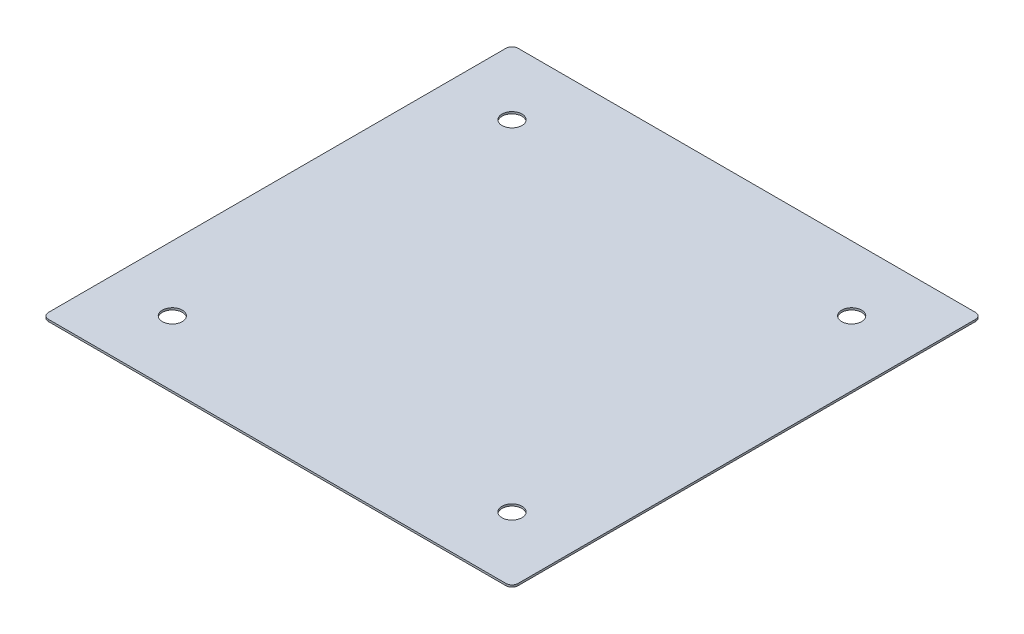
ISO-10303-21;
HEADER;
FILE_DESCRIPTION(('STEP AP214'),'2;1');
FILE_NAME('part.step','',(''),(''),'','','');
FILE_SCHEMA(('AUTOMOTIVE_DESIGN { 1 0 10303 214 1 1 1 1 }'));
ENDSEC;
DATA;
#1=APPLICATION_CONTEXT('core data for automotive mechanical design processes');
#2=APPLICATION_PROTOCOL_DEFINITION('international standard','automotive_design',2000,#1);
#3=PRODUCT_CONTEXT('',#1,'mechanical');
#4=PRODUCT('Part','Part','',(#3));
#5=PRODUCT_RELATED_PRODUCT_CATEGORY('part','',(#4));
#6=PRODUCT_DEFINITION_FORMATION('','',#4);
#7=PRODUCT_DEFINITION_CONTEXT('part definition',#1,'design');
#8=PRODUCT_DEFINITION('design','',#6,#7);
#9=PRODUCT_DEFINITION_SHAPE('','',#8);
#10=(LENGTH_UNIT() NAMED_UNIT(*) SI_UNIT(.MILLI.,.METRE.));
#11=(NAMED_UNIT(*) PLANE_ANGLE_UNIT() SI_UNIT($,.RADIAN.));
#12=(NAMED_UNIT(*) SI_UNIT($,.STERADIAN.) SOLID_ANGLE_UNIT());
#13=UNCERTAINTY_MEASURE_WITH_UNIT(LENGTH_MEASURE(1.E-05),#10,'distance_accuracy_value','');
#14=(GEOMETRIC_REPRESENTATION_CONTEXT(3) GLOBAL_UNCERTAINTY_ASSIGNED_CONTEXT((#13)) GLOBAL_UNIT_ASSIGNED_CONTEXT((#10,
#11,#12)) REPRESENTATION_CONTEXT('',''));
#15=CARTESIAN_POINT('',(0.,0.,0.));
#16=DIRECTION('',(0.,0.,1.));
#17=DIRECTION('',(1.,0.,0.));
#18=AXIS2_PLACEMENT_3D('',#15,#16,#17);
#19=CARTESIAN_POINT('',(114.5,1.,114.5));
#20=DIRECTION('',(0.,-1.,0.));
#21=DIRECTION('',(0.,0.,-1.));
#22=AXIS2_PLACEMENT_3D('',#19,#20,#21);
#23=CYLINDRICAL_SURFACE('',#22,3.);
#24=CARTESIAN_POINT('',(114.5,0.,114.5));
#25=DIRECTION('',(0.,1.,0.));
#26=DIRECTION('',(0.,0.,-1.));
#27=AXIS2_PLACEMENT_3D('',#24,#25,#26);
#28=CIRCLE('',#27,3.);
#29=CARTESIAN_POINT('',(114.5,0.,117.5));
#30=VERTEX_POINT('',#29);
#31=CARTESIAN_POINT('',(117.5,0.,114.5));
#32=VERTEX_POINT('',#31);
#33=EDGE_CURVE('E114',#30,#32,#28,.T.);
#34=ORIENTED_EDGE('',*,*,#33,.T.);
#35=DIRECTION('',(0.,-1.,0.));
#36=VECTOR('',#35,1.);
#37=CARTESIAN_POINT('',(117.5,1.,114.5));
#38=LINE('',#37,#36);
#39=CARTESIAN_POINT('',(117.5,1.,114.5));
#40=VERTEX_POINT('',#39);
#41=EDGE_CURVE('E11',#40,#32,#38,.T.);
#42=ORIENTED_EDGE('',*,*,#41,.F.);
#43=CARTESIAN_POINT('',(114.5,1.,114.5));
#44=DIRECTION('',(0.,1.,0.));
#45=DIRECTION('',(0.,0.,-1.));
#46=AXIS2_PLACEMENT_3D('',#43,#44,#45);
#47=CIRCLE('',#46,3.);
#48=CARTESIAN_POINT('',(114.5,1.,117.5));
#49=VERTEX_POINT('',#48);
#50=EDGE_CURVE('E128',#49,#40,#47,.T.);
#51=ORIENTED_EDGE('',*,*,#50,.F.);
#52=DIRECTION('',(0.,-1.,0.));
#53=VECTOR('',#52,1.);
#54=CARTESIAN_POINT('',(114.5,1.,117.5));
#55=LINE('',#54,#53);
#56=EDGE_CURVE('E108',#49,#30,#55,.T.);
#57=ORIENTED_EDGE('',*,*,#56,.T.);
#58=EDGE_LOOP('',(#34,#42,#51,#57));
#59=FACE_BOUND('',#58,.T.);
#60=ADVANCED_FACE('F17',(#59),#23,.T.);
#61=CARTESIAN_POINT('',(117.5,1.,-114.5));
#62=DIRECTION('',(-1.,0.,0.));
#63=DIRECTION('',(0.,0.,1.));
#64=AXIS2_PLACEMENT_3D('',#61,#62,#63);
#65=PLANE('',#64);
#66=DIRECTION('',(0.,0.,-1.));
#67=VECTOR('',#66,1.);
#68=CARTESIAN_POINT('',(117.5,0.,-114.5));
#69=LINE('',#68,#67);
#70=CARTESIAN_POINT('',(117.5,0.,-114.5));
#71=VERTEX_POINT('',#70);
#72=EDGE_CURVE('E116',#32,#71,#69,.T.);
#73=ORIENTED_EDGE('',*,*,#72,.T.);
#74=DIRECTION('',(0.,-1.,0.));
#75=VECTOR('',#74,1.);
#76=CARTESIAN_POINT('',(117.5,1.,-114.5));
#77=LINE('',#76,#75);
#78=CARTESIAN_POINT('',(117.5,1.,-114.5));
#79=VERTEX_POINT('',#78);
#80=EDGE_CURVE('E25',#79,#71,#77,.T.);
#81=ORIENTED_EDGE('',*,*,#80,.F.);
#82=DIRECTION('',(0.,0.,-1.));
#83=VECTOR('',#82,1.);
#84=CARTESIAN_POINT('',(117.5,1.,-114.5));
#85=LINE('',#84,#83);
#86=EDGE_CURVE('E76',#40,#79,#85,.T.);
#87=ORIENTED_EDGE('',*,*,#86,.F.);
#88=ORIENTED_EDGE('',*,*,#41,.T.);
#89=EDGE_LOOP('',(#73,#81,#87,#88));
#90=FACE_BOUND('',#89,.T.);
#91=ADVANCED_FACE('F217',(#90),#65,.F.);
#92=CARTESIAN_POINT('',(114.5,1.,-114.5));
#93=DIRECTION('',(0.,-1.,0.));
#94=DIRECTION('',(0.,0.,-1.));
#95=AXIS2_PLACEMENT_3D('',#92,#93,#94);
#96=CYLINDRICAL_SURFACE('',#95,3.);
#97=CARTESIAN_POINT('',(114.5,0.,-114.5));
#98=DIRECTION('',(0.,1.,0.));
#99=DIRECTION('',(0.,0.,1.));
#100=AXIS2_PLACEMENT_3D('',#97,#98,#99);
#101=CIRCLE('',#100,3.);
#102=CARTESIAN_POINT('',(114.5,0.,-117.5));
#103=VERTEX_POINT('',#102);
#104=EDGE_CURVE('E118',#71,#103,#101,.T.);
#105=ORIENTED_EDGE('',*,*,#104,.T.);
#106=DIRECTION('',(0.,-1.,0.));
#107=VECTOR('',#106,1.);
#108=CARTESIAN_POINT('',(114.5,1.,-117.5));
#109=LINE('',#108,#107);
#110=CARTESIAN_POINT('',(114.5,1.,-117.5));
#111=VERTEX_POINT('',#110);
#112=EDGE_CURVE('E134',#111,#103,#109,.T.);
#113=ORIENTED_EDGE('',*,*,#112,.F.);
#114=CARTESIAN_POINT('',(114.5,1.,-114.5));
#115=DIRECTION('',(0.,1.,0.));
#116=DIRECTION('',(0.,0.,1.));
#117=AXIS2_PLACEMENT_3D('',#114,#115,#116);
#118=CIRCLE('',#117,3.);
#119=EDGE_CURVE('E141',#79,#111,#118,.T.);
#120=ORIENTED_EDGE('',*,*,#119,.F.);
#121=ORIENTED_EDGE('',*,*,#80,.T.);
#122=EDGE_LOOP('',(#105,#113,#120,#121));
#123=FACE_BOUND('',#122,.T.);
#124=ADVANCED_FACE('F143',(#123),#96,.T.);
#125=CARTESIAN_POINT('',(-114.5,1.,-117.5));
#126=DIRECTION('',(0.,0.,1.));
#127=DIRECTION('',(1.,0.,0.));
#128=AXIS2_PLACEMENT_3D('',#125,#126,#127);
#129=PLANE('',#128);
#130=DIRECTION('',(-1.,0.,0.));
#131=VECTOR('',#130,1.);
#132=CARTESIAN_POINT('',(-114.5,0.,-117.5));
#133=LINE('',#132,#131);
#134=CARTESIAN_POINT('',(-114.5,0.,-117.5));
#135=VERTEX_POINT('',#134);
#136=EDGE_CURVE('E122',#103,#135,#133,.T.);
#137=ORIENTED_EDGE('',*,*,#136,.T.);
#138=DIRECTION('',(0.,-1.,0.));
#139=VECTOR('',#138,1.);
#140=CARTESIAN_POINT('',(-114.5,1.,-117.5));
#141=LINE('',#140,#139);
#142=CARTESIAN_POINT('',(-114.5,1.,-117.5));
#143=VERTEX_POINT('',#142);
#144=EDGE_CURVE('E135',#143,#135,#141,.T.);
#145=ORIENTED_EDGE('',*,*,#144,.F.);
#146=DIRECTION('',(-1.,0.,0.));
#147=VECTOR('',#146,1.);
#148=CARTESIAN_POINT('',(-114.5,1.,-117.5));
#149=LINE('',#148,#147);
#150=EDGE_CURVE('E154',#111,#143,#149,.T.);
#151=ORIENTED_EDGE('',*,*,#150,.F.);
#152=ORIENTED_EDGE('',*,*,#112,.T.);
#153=EDGE_LOOP('',(#137,#145,#151,#152));
#154=FACE_BOUND('',#153,.T.);
#155=ADVANCED_FACE('F151',(#154),#129,.F.);
#156=CARTESIAN_POINT('',(-114.5,1.,-114.5));
#157=DIRECTION('',(0.,-1.,0.));
#158=DIRECTION('',(0.,0.,-1.));
#159=AXIS2_PLACEMENT_3D('',#156,#157,#158);
#160=CYLINDRICAL_SURFACE('',#159,3.);
#161=CARTESIAN_POINT('',(-114.5,0.,-114.5));
#162=DIRECTION('',(0.,1.,0.));
#163=DIRECTION('',(0.,0.,1.));
#164=AXIS2_PLACEMENT_3D('',#161,#162,#163);
#165=CIRCLE('',#164,3.);
#166=CARTESIAN_POINT('',(-117.5,0.,-114.5));
#167=VERTEX_POINT('',#166);
#168=EDGE_CURVE('E124',#135,#167,#165,.T.);
#169=ORIENTED_EDGE('',*,*,#168,.T.);
#170=DIRECTION('',(0.,-1.,0.));
#171=VECTOR('',#170,1.);
#172=CARTESIAN_POINT('',(-117.5,1.,-114.5));
#173=LINE('',#172,#171);
#174=CARTESIAN_POINT('',(-117.5,1.,-114.5));
#175=VERTEX_POINT('',#174);
#176=EDGE_CURVE('E102',#175,#167,#173,.T.);
#177=ORIENTED_EDGE('',*,*,#176,.F.);
#178=CARTESIAN_POINT('',(-114.5,1.,-114.5));
#179=DIRECTION('',(0.,1.,0.));
#180=DIRECTION('',(0.,0.,1.));
#181=AXIS2_PLACEMENT_3D('',#178,#179,#180);
#182=CIRCLE('',#181,3.);
#183=EDGE_CURVE('E92',#143,#175,#182,.T.);
#184=ORIENTED_EDGE('',*,*,#183,.F.);
#185=ORIENTED_EDGE('',*,*,#144,.T.);
#186=EDGE_LOOP('',(#169,#177,#184,#185));
#187=FACE_BOUND('',#186,.T.);
#188=ADVANCED_FACE('F152',(#187),#160,.T.);
#189=CARTESIAN_POINT('',(-117.5,1.,-114.5));
#190=DIRECTION('',(1.,0.,0.));
#191=DIRECTION('',(0.,0.,-1.));
#192=AXIS2_PLACEMENT_3D('',#189,#190,#191);
#193=PLANE('',#192);
#194=DIRECTION('',(0.,0.,1.));
#195=VECTOR('',#194,1.);
#196=CARTESIAN_POINT('',(-117.5,0.,-114.5));
#197=LINE('',#196,#195);
#198=CARTESIAN_POINT('',(-117.5,0.,114.5));
#199=VERTEX_POINT('',#198);
#200=EDGE_CURVE('E103',#167,#199,#197,.T.);
#201=ORIENTED_EDGE('',*,*,#200,.T.);
#202=DIRECTION('',(0.,-1.,0.));
#203=VECTOR('',#202,1.);
#204=CARTESIAN_POINT('',(-117.5,1.,114.5));
#205=LINE('',#204,#203);
#206=CARTESIAN_POINT('',(-117.5,1.,114.5));
#207=VERTEX_POINT('',#206);
#208=EDGE_CURVE('E99',#207,#199,#205,.T.);
#209=ORIENTED_EDGE('',*,*,#208,.F.);
#210=DIRECTION('',(0.,0.,1.));
#211=VECTOR('',#210,1.);
#212=CARTESIAN_POINT('',(-117.5,1.,-114.5));
#213=LINE('',#212,#211);
#214=EDGE_CURVE('E90',#175,#207,#213,.T.);
#215=ORIENTED_EDGE('',*,*,#214,.F.);
#216=ORIENTED_EDGE('',*,*,#176,.T.);
#217=EDGE_LOOP('',(#201,#209,#215,#216));
#218=FACE_BOUND('',#217,.T.);
#219=ADVANCED_FACE('F101',(#218),#193,.F.);
#220=CARTESIAN_POINT('',(-114.5,1.,114.5));
#221=DIRECTION('',(0.,-1.,0.));
#222=DIRECTION('',(0.,0.,-1.));
#223=AXIS2_PLACEMENT_3D('',#220,#221,#222);
#224=CYLINDRICAL_SURFACE('',#223,3.);
#225=CARTESIAN_POINT('',(-114.5,0.,114.5));
#226=DIRECTION('',(0.,1.,0.));
#227=DIRECTION('',(0.,0.,-1.));
#228=AXIS2_PLACEMENT_3D('',#225,#226,#227);
#229=CIRCLE('',#228,3.);
#230=CARTESIAN_POINT('',(-114.5,0.,117.5));
#231=VERTEX_POINT('',#230);
#232=EDGE_CURVE('E62',#199,#231,#229,.T.);
#233=ORIENTED_EDGE('',*,*,#232,.T.);
#234=DIRECTION('',(0.,-1.,0.));
#235=VECTOR('',#234,1.);
#236=CARTESIAN_POINT('',(-114.5,1.,117.5));
#237=LINE('',#236,#235);
#238=CARTESIAN_POINT('',(-114.5,1.,117.5));
#239=VERTEX_POINT('',#238);
#240=EDGE_CURVE('E104',#239,#231,#237,.T.);
#241=ORIENTED_EDGE('',*,*,#240,.F.);
#242=CARTESIAN_POINT('',(-114.5,1.,114.5));
#243=DIRECTION('',(0.,1.,0.));
#244=DIRECTION('',(0.,0.,-1.));
#245=AXIS2_PLACEMENT_3D('',#242,#243,#244);
#246=CIRCLE('',#245,3.);
#247=EDGE_CURVE('E91',#207,#239,#246,.T.);
#248=ORIENTED_EDGE('',*,*,#247,.F.);
#249=ORIENTED_EDGE('',*,*,#208,.T.);
#250=EDGE_LOOP('',(#233,#241,#248,#249));
#251=FACE_BOUND('',#250,.T.);
#252=ADVANCED_FACE('F110',(#251),#224,.T.);
#253=CARTESIAN_POINT('',(-114.5,1.,117.5));
#254=DIRECTION('',(0.,0.,-1.));
#255=DIRECTION('',(-1.,0.,0.));
#256=AXIS2_PLACEMENT_3D('',#253,#254,#255);
#257=PLANE('',#256);
#258=DIRECTION('',(1.,0.,0.));
#259=VECTOR('',#258,1.);
#260=CARTESIAN_POINT('',(-114.5,0.,117.5));
#261=LINE('',#260,#259);
#262=EDGE_CURVE('E69',#231,#30,#261,.T.);
#263=ORIENTED_EDGE('',*,*,#262,.T.);
#264=ORIENTED_EDGE('',*,*,#56,.F.);
#265=DIRECTION('',(1.,0.,0.));
#266=VECTOR('',#265,1.);
#267=CARTESIAN_POINT('',(-114.5,1.,117.5));
#268=LINE('',#267,#266);
#269=EDGE_CURVE('E31',#239,#49,#268,.T.);
#270=ORIENTED_EDGE('',*,*,#269,.F.);
#271=ORIENTED_EDGE('',*,*,#240,.T.);
#272=EDGE_LOOP('',(#263,#264,#270,#271));
#273=FACE_BOUND('',#272,.T.);
#274=ADVANCED_FACE('F226',(#273),#257,.F.);
#275=CARTESIAN_POINT('',(114.5,1.,114.5));
#276=DIRECTION('',(0.,-1.,0.));
#277=DIRECTION('',(0.,0.,-1.));
#278=AXIS2_PLACEMENT_3D('',#275,#276,#277);
#279=PLANE('',#278);
#280=CARTESIAN_POINT('',(85.,1.,85.));
#281=DIRECTION('',(0.,-1.,0.));
#282=DIRECTION('',(0.,0.,-1.));
#283=AXIS2_PLACEMENT_3D('',#280,#281,#282);
#284=CIRCLE('',#283,5.);
#285=CARTESIAN_POINT('',(85.,1.,80.));
#286=VERTEX_POINT('',#285);
#287=EDGE_CURVE('E163',#286,#286,#284,.T.);
#288=ORIENTED_EDGE('',*,*,#287,.T.);
#289=EDGE_LOOP('',(#288));
#290=FACE_BOUND('',#289,.T.);
#291=CARTESIAN_POINT('',(-85.,1.,-85.));
#292=DIRECTION('',(0.,-1.,0.));
#293=DIRECTION('',(0.,0.,-1.));
#294=AXIS2_PLACEMENT_3D('',#291,#292,#293);
#295=CIRCLE('',#294,5.);
#296=CARTESIAN_POINT('',(-85.,1.,-90.));
#297=VERTEX_POINT('',#296);
#298=EDGE_CURVE('E177',#297,#297,#295,.T.);
#299=ORIENTED_EDGE('',*,*,#298,.T.);
#300=EDGE_LOOP('',(#299));
#301=FACE_BOUND('',#300,.T.);
#302=CARTESIAN_POINT('',(85.,1.,-85.));
#303=DIRECTION('',(0.,-1.,0.));
#304=DIRECTION('',(0.,0.,-1.));
#305=AXIS2_PLACEMENT_3D('',#302,#303,#304);
#306=CIRCLE('',#305,5.);
#307=CARTESIAN_POINT('',(85.,1.,-90.));
#308=VERTEX_POINT('',#307);
#309=EDGE_CURVE('E168',#308,#308,#306,.T.);
#310=ORIENTED_EDGE('',*,*,#309,.T.);
#311=EDGE_LOOP('',(#310));
#312=FACE_BOUND('',#311,.T.);
#313=CARTESIAN_POINT('',(-85.,1.,85.));
#314=DIRECTION('',(0.,-1.,0.));
#315=DIRECTION('',(0.,0.,-1.));
#316=AXIS2_PLACEMENT_3D('',#313,#314,#315);
#317=CIRCLE('',#316,5.);
#318=CARTESIAN_POINT('',(-85.,1.,80.));
#319=VERTEX_POINT('',#318);
#320=EDGE_CURVE('E117',#319,#319,#317,.T.);
#321=ORIENTED_EDGE('',*,*,#320,.T.);
#322=EDGE_LOOP('',(#321));
#323=FACE_BOUND('',#322,.T.);
#324=ORIENTED_EDGE('',*,*,#50,.T.);
#325=ORIENTED_EDGE('',*,*,#86,.T.);
#326=ORIENTED_EDGE('',*,*,#119,.T.);
#327=ORIENTED_EDGE('',*,*,#150,.T.);
#328=ORIENTED_EDGE('',*,*,#183,.T.);
#329=ORIENTED_EDGE('',*,*,#214,.T.);
#330=ORIENTED_EDGE('',*,*,#247,.T.);
#331=ORIENTED_EDGE('',*,*,#269,.T.);
#332=EDGE_LOOP('',(#324,#325,#326,#327,#328,#329,#330,#331));
#333=FACE_BOUND('',#332,.T.);
#334=ADVANCED_FACE('F93',(#290,#301,#312,#323,#333),#279,.F.);
#335=CARTESIAN_POINT('',(114.5,0.,114.5));
#336=DIRECTION('',(0.,-1.,0.));
#337=DIRECTION('',(0.,0.,-1.));
#338=AXIS2_PLACEMENT_3D('',#335,#336,#337);
#339=PLANE('',#338);
#340=CARTESIAN_POINT('',(85.,0.,85.));
#341=DIRECTION('',(0.,-1.,0.));
#342=DIRECTION('',(0.,0.,-1.));
#343=AXIS2_PLACEMENT_3D('',#340,#341,#342);
#344=CIRCLE('',#343,5.);
#345=CARTESIAN_POINT('',(85.,0.,80.));
#346=VERTEX_POINT('',#345);
#347=EDGE_CURVE('E176',#346,#346,#344,.T.);
#348=ORIENTED_EDGE('',*,*,#347,.F.);
#349=EDGE_LOOP('',(#348));
#350=FACE_BOUND('',#349,.T.);
#351=CARTESIAN_POINT('',(-85.,0.,-85.));
#352=DIRECTION('',(0.,-1.,0.));
#353=DIRECTION('',(0.,0.,-1.));
#354=AXIS2_PLACEMENT_3D('',#351,#352,#353);
#355=CIRCLE('',#354,5.);
#356=CARTESIAN_POINT('',(-85.,0.,-90.));
#357=VERTEX_POINT('',#356);
#358=EDGE_CURVE('E174',#357,#357,#355,.T.);
#359=ORIENTED_EDGE('',*,*,#358,.F.);
#360=EDGE_LOOP('',(#359));
#361=FACE_BOUND('',#360,.T.);
#362=CARTESIAN_POINT('',(85.,0.,-85.));
#363=DIRECTION('',(0.,-1.,0.));
#364=DIRECTION('',(0.,0.,-1.));
#365=AXIS2_PLACEMENT_3D('',#362,#363,#364);
#366=CIRCLE('',#365,5.);
#367=CARTESIAN_POINT('',(85.,0.,-90.));
#368=VERTEX_POINT('',#367);
#369=EDGE_CURVE('E170',#368,#368,#366,.T.);
#370=ORIENTED_EDGE('',*,*,#369,.F.);
#371=EDGE_LOOP('',(#370));
#372=FACE_BOUND('',#371,.T.);
#373=CARTESIAN_POINT('',(-85.,0.,85.));
#374=DIRECTION('',(0.,-1.,0.));
#375=DIRECTION('',(0.,0.,-1.));
#376=AXIS2_PLACEMENT_3D('',#373,#374,#375);
#377=CIRCLE('',#376,5.);
#378=CARTESIAN_POINT('',(-85.,0.,80.));
#379=VERTEX_POINT('',#378);
#380=EDGE_CURVE('E161',#379,#379,#377,.T.);
#381=ORIENTED_EDGE('',*,*,#380,.F.);
#382=EDGE_LOOP('',(#381));
#383=FACE_BOUND('',#382,.T.);
#384=ORIENTED_EDGE('',*,*,#33,.F.);
#385=ORIENTED_EDGE('',*,*,#262,.F.);
#386=ORIENTED_EDGE('',*,*,#232,.F.);
#387=ORIENTED_EDGE('',*,*,#200,.F.);
#388=ORIENTED_EDGE('',*,*,#168,.F.);
#389=ORIENTED_EDGE('',*,*,#136,.F.);
#390=ORIENTED_EDGE('',*,*,#104,.F.);
#391=ORIENTED_EDGE('',*,*,#72,.F.);
#392=EDGE_LOOP('',(#384,#385,#386,#387,#388,#389,#390,#391));
#393=FACE_BOUND('',#392,.T.);
#394=ADVANCED_FACE('F150',(#350,#361,#372,#383,#393),#339,.T.);
#395=CARTESIAN_POINT('',(-85.,1.,85.));
#396=DIRECTION('',(0.,-1.,0.));
#397=DIRECTION('',(0.,0.,-1.));
#398=AXIS2_PLACEMENT_3D('',#395,#396,#397);
#399=CYLINDRICAL_SURFACE('',#398,5.);
#400=ORIENTED_EDGE('',*,*,#320,.F.);
#401=EDGE_LOOP('',(#400));
#402=FACE_BOUND('',#401,.T.);
#403=ORIENTED_EDGE('',*,*,#380,.T.);
#404=EDGE_LOOP('',(#403));
#405=FACE_BOUND('',#404,.T.);
#406=ADVANCED_FACE('F198',(#402,#405),#399,.F.);
#407=CARTESIAN_POINT('',(85.,1.,-85.));
#408=DIRECTION('',(0.,-1.,0.));
#409=DIRECTION('',(0.,0.,-1.));
#410=AXIS2_PLACEMENT_3D('',#407,#408,#409);
#411=CYLINDRICAL_SURFACE('',#410,5.);
#412=ORIENTED_EDGE('',*,*,#309,.F.);
#413=EDGE_LOOP('',(#412));
#414=FACE_BOUND('',#413,.T.);
#415=ORIENTED_EDGE('',*,*,#369,.T.);
#416=EDGE_LOOP('',(#415));
#417=FACE_BOUND('',#416,.T.);
#418=ADVANCED_FACE('F202',(#414,#417),#411,.F.);
#419=CARTESIAN_POINT('',(-85.,1.,-85.));
#420=DIRECTION('',(0.,-1.,0.));
#421=DIRECTION('',(0.,0.,-1.));
#422=AXIS2_PLACEMENT_3D('',#419,#420,#421);
#423=CYLINDRICAL_SURFACE('',#422,5.);
#424=ORIENTED_EDGE('',*,*,#298,.F.);
#425=EDGE_LOOP('',(#424));
#426=FACE_BOUND('',#425,.T.);
#427=ORIENTED_EDGE('',*,*,#358,.T.);
#428=EDGE_LOOP('',(#427));
#429=FACE_BOUND('',#428,.T.);
#430=ADVANCED_FACE('F189',(#426,#429),#423,.F.);
#431=CARTESIAN_POINT('',(85.,1.,85.));
#432=DIRECTION('',(0.,-1.,0.));
#433=DIRECTION('',(0.,0.,-1.));
#434=AXIS2_PLACEMENT_3D('',#431,#432,#433);
#435=CYLINDRICAL_SURFACE('',#434,5.);
#436=ORIENTED_EDGE('',*,*,#287,.F.);
#437=EDGE_LOOP('',(#436));
#438=FACE_BOUND('',#437,.T.);
#439=ORIENTED_EDGE('',*,*,#347,.T.);
#440=EDGE_LOOP('',(#439));
#441=FACE_BOUND('',#440,.T.);
#442=ADVANCED_FACE('F190',(#438,#441),#435,.F.);
#443=CLOSED_SHELL('',(#60,#91,#124,#155,#188,#219,#252,#274,#334,#394,#406,#418,#430,#442));
#444=MANIFOLD_SOLID_BREP('B1',#443);
#445=ADVANCED_BREP_SHAPE_REPRESENTATION('',(#18,#444),#14);
#446=SHAPE_DEFINITION_REPRESENTATION(#9,#445);
ENDSEC;
END-ISO-10303-21;
